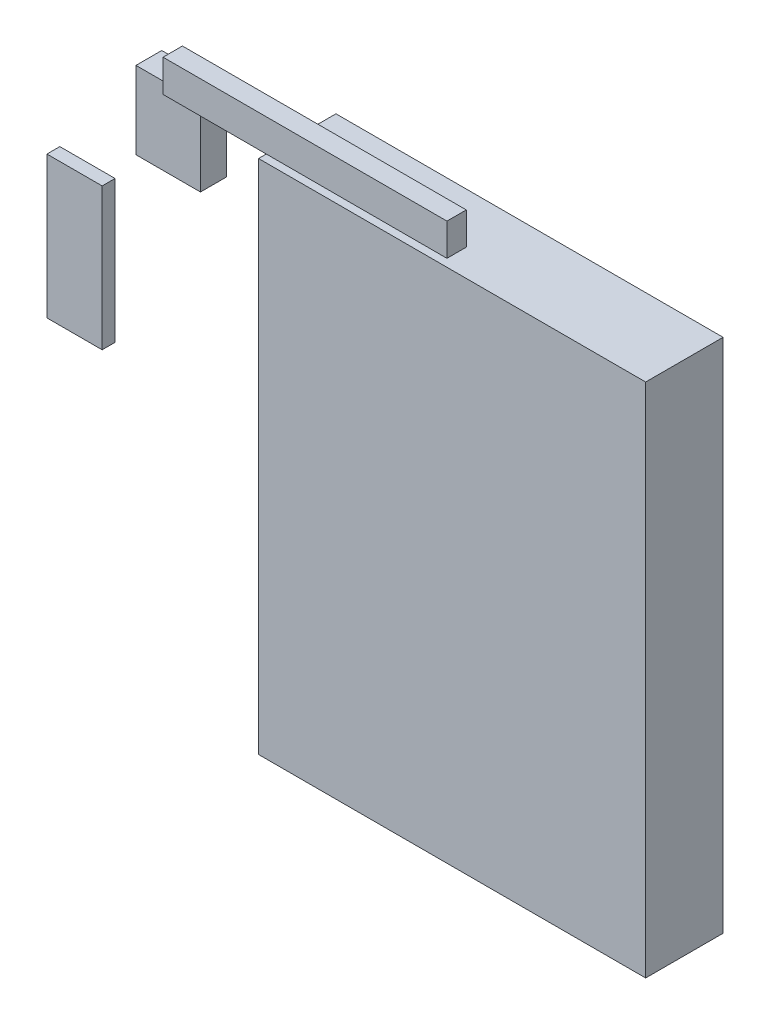
ISO-10303-21;
HEADER;
FILE_DESCRIPTION(('STEP AP214'),'2;1');
FILE_NAME('part.step','',(''),(''),'','','');
FILE_SCHEMA(('AUTOMOTIVE_DESIGN { 1 0 10303 214 1 1 1 1 }'));
ENDSEC;
DATA;
#1=APPLICATION_CONTEXT('core data for automotive mechanical design processes');
#2=APPLICATION_PROTOCOL_DEFINITION('international standard','automotive_design',2000,#1);
#3=PRODUCT_CONTEXT('',#1,'mechanical');
#4=PRODUCT('Part','Part','',(#3));
#5=PRODUCT_RELATED_PRODUCT_CATEGORY('part','',(#4));
#6=PRODUCT_DEFINITION_FORMATION('','',#4);
#7=PRODUCT_DEFINITION_CONTEXT('part definition',#1,'design');
#8=PRODUCT_DEFINITION('design','',#6,#7);
#9=PRODUCT_DEFINITION_SHAPE('','',#8);
#10=(LENGTH_UNIT() NAMED_UNIT(*) SI_UNIT(.MILLI.,.METRE.));
#11=(NAMED_UNIT(*) PLANE_ANGLE_UNIT() SI_UNIT($,.RADIAN.));
#12=(NAMED_UNIT(*) SI_UNIT($,.STERADIAN.) SOLID_ANGLE_UNIT());
#13=UNCERTAINTY_MEASURE_WITH_UNIT(LENGTH_MEASURE(1.E-05),#10,'distance_accuracy_value','');
#14=(GEOMETRIC_REPRESENTATION_CONTEXT(3) GLOBAL_UNCERTAINTY_ASSIGNED_CONTEXT((#13)) GLOBAL_UNIT_ASSIGNED_CONTEXT((#10,
#11,#12)) REPRESENTATION_CONTEXT('',''));
#15=CARTESIAN_POINT('',(0.,0.,0.));
#16=DIRECTION('',(0.,0.,1.));
#17=DIRECTION('',(1.,0.,0.));
#18=AXIS2_PLACEMENT_3D('',#15,#16,#17);
#19=CARTESIAN_POINT('',(-4.,49.5,3.));
#20=DIRECTION('',(1.,0.,0.));
#21=DIRECTION('',(0.,0.,-1.));
#22=AXIS2_PLACEMENT_3D('',#19,#20,#21);
#23=PLANE('',#22);
#24=DIRECTION('',(0.,-1.,0.));
#25=VECTOR('',#24,1.);
#26=CARTESIAN_POINT('',(-4.,49.5,2.));
#27=LINE('',#26,#25);
#28=CARTESIAN_POINT('',(-4.,49.5,2.));
#29=VERTEX_POINT('',#28);
#30=CARTESIAN_POINT('',(-4.,38.5,2.));
#31=VERTEX_POINT('',#30);
#32=EDGE_CURVE('E113',#29,#31,#27,.T.);
#33=ORIENTED_EDGE('',*,*,#32,.T.);
#34=DIRECTION('',(0.,0.,-1.));
#35=VECTOR('',#34,1.);
#36=CARTESIAN_POINT('',(-4.,38.5,3.));
#37=LINE('',#36,#35);
#38=CARTESIAN_POINT('',(-4.,38.5,3.));
#39=VERTEX_POINT('',#38);
#40=EDGE_CURVE('E12',#39,#31,#37,.T.);
#41=ORIENTED_EDGE('',*,*,#40,.F.);
#42=DIRECTION('',(0.,-1.,0.));
#43=VECTOR('',#42,1.);
#44=CARTESIAN_POINT('',(-4.,49.5,3.));
#45=LINE('',#44,#43);
#46=CARTESIAN_POINT('',(-4.,49.5,3.));
#47=VERTEX_POINT('',#46);
#48=EDGE_CURVE('E101',#47,#39,#45,.T.);
#49=ORIENTED_EDGE('',*,*,#48,.F.);
#50=DIRECTION('',(0.,0.,-1.));
#51=VECTOR('',#50,1.);
#52=CARTESIAN_POINT('',(-4.,49.5,3.));
#53=LINE('',#52,#51);
#54=EDGE_CURVE('E109',#47,#29,#53,.T.);
#55=ORIENTED_EDGE('',*,*,#54,.T.);
#56=EDGE_LOOP('',(#33,#41,#49,#55));
#57=FACE_BOUND('',#56,.T.);
#58=ADVANCED_FACE('F50',(#57),#23,.F.);
#59=CARTESIAN_POINT('',(-4.,38.5,3.));
#60=DIRECTION('',(0.,1.,0.));
#61=DIRECTION('',(0.,0.,1.));
#62=AXIS2_PLACEMENT_3D('',#59,#60,#61);
#63=PLANE('',#62);
#64=DIRECTION('',(1.,0.,0.));
#65=VECTOR('',#64,1.);
#66=CARTESIAN_POINT('',(-4.,38.5,2.));
#67=LINE('',#66,#65);
#68=CARTESIAN_POINT('',(0.28,38.5,2.));
#69=VERTEX_POINT('',#68);
#70=EDGE_CURVE('E105',#31,#69,#67,.T.);
#71=ORIENTED_EDGE('',*,*,#70,.T.);
#72=DIRECTION('',(0.,0.,-1.));
#73=VECTOR('',#72,1.);
#74=CARTESIAN_POINT('',(0.28,38.5,3.));
#75=LINE('',#74,#73);
#76=CARTESIAN_POINT('',(0.28,38.5,3.));
#77=VERTEX_POINT('',#76);
#78=EDGE_CURVE('E58',#77,#69,#75,.T.);
#79=ORIENTED_EDGE('',*,*,#78,.F.);
#80=DIRECTION('',(1.,0.,0.));
#81=VECTOR('',#80,1.);
#82=CARTESIAN_POINT('',(-4.,38.5,3.));
#83=LINE('',#82,#81);
#84=EDGE_CURVE('E96',#39,#77,#83,.T.);
#85=ORIENTED_EDGE('',*,*,#84,.F.);
#86=ORIENTED_EDGE('',*,*,#40,.T.);
#87=EDGE_LOOP('',(#71,#79,#85,#86));
#88=FACE_BOUND('',#87,.T.);
#89=ADVANCED_FACE('F104',(#88),#63,.F.);
#90=CARTESIAN_POINT('',(0.28,38.5,3.));
#91=DIRECTION('',(-1.,0.,0.));
#92=DIRECTION('',(0.,0.,1.));
#93=AXIS2_PLACEMENT_3D('',#90,#91,#92);
#94=PLANE('',#93);
#95=DIRECTION('',(0.,1.,0.));
#96=VECTOR('',#95,1.);
#97=CARTESIAN_POINT('',(0.28,38.5,2.));
#98=LINE('',#97,#96);
#99=CARTESIAN_POINT('',(0.28,49.5,2.));
#100=VERTEX_POINT('',#99);
#101=EDGE_CURVE('E83',#69,#100,#98,.T.);
#102=ORIENTED_EDGE('',*,*,#101,.T.);
#103=DIRECTION('',(0.,0.,-1.));
#104=VECTOR('',#103,1.);
#105=CARTESIAN_POINT('',(0.28,49.5,3.));
#106=LINE('',#105,#104);
#107=CARTESIAN_POINT('',(0.28,49.5,3.));
#108=VERTEX_POINT('',#107);
#109=EDGE_CURVE('E106',#108,#100,#106,.T.);
#110=ORIENTED_EDGE('',*,*,#109,.F.);
#111=DIRECTION('',(0.,1.,0.));
#112=VECTOR('',#111,1.);
#113=CARTESIAN_POINT('',(0.28,38.5,3.));
#114=LINE('',#113,#112);
#115=EDGE_CURVE('E99',#77,#108,#114,.T.);
#116=ORIENTED_EDGE('',*,*,#115,.F.);
#117=ORIENTED_EDGE('',*,*,#78,.T.);
#118=EDGE_LOOP('',(#102,#110,#116,#117));
#119=FACE_BOUND('',#118,.T.);
#120=ADVANCED_FACE('F107',(#119),#94,.F.);
#121=CARTESIAN_POINT('',(0.28,49.5,3.));
#122=DIRECTION('',(0.,-1.,0.));
#123=DIRECTION('',(0.,0.,-1.));
#124=AXIS2_PLACEMENT_3D('',#121,#122,#123);
#125=PLANE('',#124);
#126=DIRECTION('',(-1.,0.,0.));
#127=VECTOR('',#126,1.);
#128=CARTESIAN_POINT('',(0.28,49.5,2.));
#129=LINE('',#128,#127);
#130=EDGE_CURVE('E89',#100,#29,#129,.T.);
#131=ORIENTED_EDGE('',*,*,#130,.T.);
#132=ORIENTED_EDGE('',*,*,#54,.F.);
#133=DIRECTION('',(-1.,0.,0.));
#134=VECTOR('',#133,1.);
#135=CARTESIAN_POINT('',(0.28,49.5,3.));
#136=LINE('',#135,#134);
#137=EDGE_CURVE('E66',#108,#47,#136,.T.);
#138=ORIENTED_EDGE('',*,*,#137,.F.);
#139=ORIENTED_EDGE('',*,*,#109,.T.);
#140=EDGE_LOOP('',(#131,#132,#138,#139));
#141=FACE_BOUND('',#140,.T.);
#142=ADVANCED_FACE('F120',(#141),#125,.F.);
#143=CARTESIAN_POINT('',(0.,0.,3.));
#144=DIRECTION('',(0.,0.,1.));
#145=DIRECTION('',(1.,0.,0.));
#146=AXIS2_PLACEMENT_3D('',#143,#144,#145);
#147=PLANE('',#146);
#148=ORIENTED_EDGE('',*,*,#48,.T.);
#149=ORIENTED_EDGE('',*,*,#84,.T.);
#150=ORIENTED_EDGE('',*,*,#115,.T.);
#151=ORIENTED_EDGE('',*,*,#137,.T.);
#152=EDGE_LOOP('',(#148,#149,#150,#151));
#153=FACE_BOUND('',#152,.T.);
#154=ADVANCED_FACE('F97',(#153),#147,.T.);
#155=CARTESIAN_POINT('',(0.,0.,2.));
#156=DIRECTION('',(0.,0.,1.));
#157=DIRECTION('',(1.,0.,0.));
#158=AXIS2_PLACEMENT_3D('',#155,#156,#157);
#159=PLANE('',#158);
#160=ORIENTED_EDGE('',*,*,#32,.F.);
#161=ORIENTED_EDGE('',*,*,#130,.F.);
#162=ORIENTED_EDGE('',*,*,#101,.F.);
#163=ORIENTED_EDGE('',*,*,#70,.F.);
#164=EDGE_LOOP('',(#160,#161,#162,#163));
#165=FACE_BOUND('',#164,.T.);
#166=ADVANCED_FACE('F123',(#165),#159,.F.);
#167=CLOSED_SHELL('',(#58,#89,#120,#142,#154,#166));
#168=MANIFOLD_SOLID_BREP('B2',#167);
#169=CARTESIAN_POINT('',(12.,67.5,10.));
#170=DIRECTION('',(1.,0.,0.));
#171=DIRECTION('',(0.,0.,-1.));
#172=AXIS2_PLACEMENT_3D('',#169,#170,#171);
#173=PLANE('',#172);
#174=DIRECTION('',(0.,0.,-1.));
#175=VECTOR('',#174,1.);
#176=CARTESIAN_POINT('',(12.,65.5,10.));
#177=LINE('',#176,#175);
#178=CARTESIAN_POINT('',(12.,65.5,9.6));
#179=VERTEX_POINT('',#178);
#180=CARTESIAN_POINT('',(12.,65.5,8.5));
#181=VERTEX_POINT('',#180);
#182=EDGE_CURVE('E209',#179,#181,#177,.T.);
#183=ORIENTED_EDGE('',*,*,#182,.F.);
#184=DIRECTION('',(0.,-1.,0.));
#185=VECTOR('',#184,1.);
#186=CARTESIAN_POINT('',(12.,67.5,9.6));
#187=LINE('',#186,#185);
#188=CARTESIAN_POINT('',(12.,65.,9.6));
#189=VERTEX_POINT('',#188);
#190=EDGE_CURVE('E305',#179,#189,#187,.T.);
#191=ORIENTED_EDGE('',*,*,#190,.T.);
#192=DIRECTION('',(0.,0.,-1.));
#193=VECTOR('',#192,1.);
#194=CARTESIAN_POINT('',(12.,65.,10.));
#195=LINE('',#194,#193);
#196=CARTESIAN_POINT('',(12.,65.,10.));
#197=VERTEX_POINT('',#196);
#198=EDGE_CURVE('E333',#197,#189,#195,.T.);
#199=ORIENTED_EDGE('',*,*,#198,.F.);
#200=DIRECTION('',(0.,-1.,0.));
#201=VECTOR('',#200,1.);
#202=CARTESIAN_POINT('',(12.,67.5,10.));
#203=LINE('',#202,#201);
#204=CARTESIAN_POINT('',(12.,67.5,10.));
#205=VERTEX_POINT('',#204);
#206=EDGE_CURVE('E308',#205,#197,#203,.T.);
#207=ORIENTED_EDGE('',*,*,#206,.F.);
#208=DIRECTION('',(0.,0.,-1.));
#209=VECTOR('',#208,1.);
#210=CARTESIAN_POINT('',(12.,67.5,10.));
#211=LINE('',#210,#209);
#212=CARTESIAN_POINT('',(12.,67.5,8.5));
#213=VERTEX_POINT('',#212);
#214=EDGE_CURVE('E318',#205,#213,#211,.T.);
#215=ORIENTED_EDGE('',*,*,#214,.T.);
#216=DIRECTION('',(0.,-1.,0.));
#217=VECTOR('',#216,1.);
#218=CARTESIAN_POINT('',(12.,67.5,8.5));
#219=LINE('',#218,#217);
#220=EDGE_CURVE('E307',#213,#181,#219,.T.);
#221=ORIENTED_EDGE('',*,*,#220,.T.);
#222=EDGE_LOOP('',(#183,#191,#199,#207,#215,#221));
#223=FACE_BOUND('',#222,.T.);
#224=ADVANCED_FACE('F195',(#223),#173,.F.);
#225=CARTESIAN_POINT('',(12.,65.,10.));
#226=DIRECTION('',(0.,1.,0.));
#227=DIRECTION('',(0.,0.,1.));
#228=AXIS2_PLACEMENT_3D('',#225,#226,#227);
#229=PLANE('',#228);
#230=DIRECTION('',(0.,0.,1.));
#231=VECTOR('',#230,1.);
#232=CARTESIAN_POINT('',(14.5,65.,10.));
#233=LINE('',#232,#231);
#234=CARTESIAN_POINT('',(14.5,65.,8.5));
#235=VERTEX_POINT('',#234);
#236=CARTESIAN_POINT('',(14.5,65.,9.6));
#237=VERTEX_POINT('',#236);
#238=EDGE_CURVE('E298',#235,#237,#233,.T.);
#239=ORIENTED_EDGE('',*,*,#238,.F.);
#240=DIRECTION('',(1.,0.,0.));
#241=VECTOR('',#240,1.);
#242=CARTESIAN_POINT('',(12.,65.,8.5));
#243=LINE('',#242,#241);
#244=CARTESIAN_POINT('',(34.,65.,8.5));
#245=VERTEX_POINT('',#244);
#246=EDGE_CURVE('E320',#235,#245,#243,.T.);
#247=ORIENTED_EDGE('',*,*,#246,.T.);
#248=DIRECTION('',(0.,0.,-1.));
#249=VECTOR('',#248,1.);
#250=CARTESIAN_POINT('',(34.,65.,10.));
#251=LINE('',#250,#249);
#252=CARTESIAN_POINT('',(34.,65.,10.));
#253=VERTEX_POINT('',#252);
#254=EDGE_CURVE('E330',#253,#245,#251,.T.);
#255=ORIENTED_EDGE('',*,*,#254,.F.);
#256=DIRECTION('',(1.,0.,0.));
#257=VECTOR('',#256,1.);
#258=CARTESIAN_POINT('',(12.,65.,10.));
#259=LINE('',#258,#257);
#260=EDGE_CURVE('E311',#197,#253,#259,.T.);
#261=ORIENTED_EDGE('',*,*,#260,.F.);
#262=ORIENTED_EDGE('',*,*,#198,.T.);
#263=DIRECTION('',(1.,0.,0.));
#264=VECTOR('',#263,1.);
#265=CARTESIAN_POINT('',(12.,65.,9.6));
#266=LINE('',#265,#264);
#267=EDGE_CURVE('E48',#189,#237,#266,.T.);
#268=ORIENTED_EDGE('',*,*,#267,.T.);
#269=EDGE_LOOP('',(#239,#247,#255,#261,#262,#268));
#270=FACE_BOUND('',#269,.T.);
#271=ADVANCED_FACE('F365',(#270),#229,.F.);
#272=CARTESIAN_POINT('',(0.,0.,8.5));
#273=DIRECTION('',(0.,0.,1.));
#274=DIRECTION('',(1.,0.,0.));
#275=AXIS2_PLACEMENT_3D('',#272,#273,#274);
#276=PLANE('',#275);
#277=DIRECTION('',(0.,-1.,0.));
#278=VECTOR('',#277,1.);
#279=CARTESIAN_POINT('',(14.5,0.,8.5));
#280=LINE('',#279,#278);
#281=CARTESIAN_POINT('',(14.5,65.5,8.5));
#282=VERTEX_POINT('',#281);
#283=EDGE_CURVE('E202',#282,#235,#280,.T.);
#284=ORIENTED_EDGE('',*,*,#283,.F.);
#285=DIRECTION('',(1.,0.,0.));
#286=VECTOR('',#285,1.);
#287=CARTESIAN_POINT('',(0.,65.5,8.5));
#288=LINE('',#287,#286);
#289=EDGE_CURVE('E335',#181,#282,#288,.T.);
#290=ORIENTED_EDGE('',*,*,#289,.F.);
#291=ORIENTED_EDGE('',*,*,#220,.F.);
#292=DIRECTION('',(-1.,0.,0.));
#293=VECTOR('',#292,1.);
#294=CARTESIAN_POINT('',(34.,67.5,8.5));
#295=LINE('',#294,#293);
#296=CARTESIAN_POINT('',(34.,67.5,8.5));
#297=VERTEX_POINT('',#296);
#298=EDGE_CURVE('E312',#297,#213,#295,.T.);
#299=ORIENTED_EDGE('',*,*,#298,.F.);
#300=DIRECTION('',(0.,1.,0.));
#301=VECTOR('',#300,1.);
#302=CARTESIAN_POINT('',(34.,65.,8.5));
#303=LINE('',#302,#301);
#304=EDGE_CURVE('E322',#245,#297,#303,.T.);
#305=ORIENTED_EDGE('',*,*,#304,.F.);
#306=ORIENTED_EDGE('',*,*,#246,.F.);
#307=EDGE_LOOP('',(#284,#290,#291,#299,#305,#306));
#308=FACE_BOUND('',#307,.T.);
#309=ADVANCED_FACE('F344',(#308),#276,.F.);
#310=CARTESIAN_POINT('',(34.,65.,10.));
#311=DIRECTION('',(-1.,0.,0.));
#312=DIRECTION('',(0.,0.,1.));
#313=AXIS2_PLACEMENT_3D('',#310,#311,#312);
#314=PLANE('',#313);
#315=ORIENTED_EDGE('',*,*,#304,.T.);
#316=DIRECTION('',(0.,0.,-1.));
#317=VECTOR('',#316,1.);
#318=CARTESIAN_POINT('',(34.,67.5,10.));
#319=LINE('',#318,#317);
#320=CARTESIAN_POINT('',(34.,67.5,10.));
#321=VERTEX_POINT('',#320);
#322=EDGE_CURVE('E327',#321,#297,#319,.T.);
#323=ORIENTED_EDGE('',*,*,#322,.F.);
#324=DIRECTION('',(0.,1.,0.));
#325=VECTOR('',#324,1.);
#326=CARTESIAN_POINT('',(34.,65.,10.));
#327=LINE('',#326,#325);
#328=EDGE_CURVE('E314',#253,#321,#327,.T.);
#329=ORIENTED_EDGE('',*,*,#328,.F.);
#330=ORIENTED_EDGE('',*,*,#254,.T.);
#331=EDGE_LOOP('',(#315,#323,#329,#330));
#332=FACE_BOUND('',#331,.T.);
#333=ADVANCED_FACE('F377',(#332),#314,.F.);
#334=CARTESIAN_POINT('',(34.,67.5,10.));
#335=DIRECTION('',(0.,-1.,0.));
#336=DIRECTION('',(0.,0.,-1.));
#337=AXIS2_PLACEMENT_3D('',#334,#335,#336);
#338=PLANE('',#337);
#339=ORIENTED_EDGE('',*,*,#298,.T.);
#340=ORIENTED_EDGE('',*,*,#214,.F.);
#341=DIRECTION('',(-1.,0.,0.));
#342=VECTOR('',#341,1.);
#343=CARTESIAN_POINT('',(34.,67.5,10.));
#344=LINE('',#343,#342);
#345=EDGE_CURVE('E316',#321,#205,#344,.T.);
#346=ORIENTED_EDGE('',*,*,#345,.F.);
#347=ORIENTED_EDGE('',*,*,#322,.T.);
#348=EDGE_LOOP('',(#339,#340,#346,#347));
#349=FACE_BOUND('',#348,.T.);
#350=ADVANCED_FACE('F374',(#349),#338,.F.);
#351=CARTESIAN_POINT('',(0.,0.,10.));
#352=DIRECTION('',(0.,0.,1.));
#353=DIRECTION('',(1.,0.,0.));
#354=AXIS2_PLACEMENT_3D('',#351,#352,#353);
#355=PLANE('',#354);
#356=ORIENTED_EDGE('',*,*,#206,.T.);
#357=ORIENTED_EDGE('',*,*,#260,.T.);
#358=ORIENTED_EDGE('',*,*,#328,.T.);
#359=ORIENTED_EDGE('',*,*,#345,.T.);
#360=EDGE_LOOP('',(#356,#357,#358,#359));
#361=FACE_BOUND('',#360,.T.);
#362=ADVANCED_FACE('F369',(#361),#355,.T.);
#363=CARTESIAN_POINT('',(0.,0.,9.6));
#364=DIRECTION('',(0.,0.,1.));
#365=DIRECTION('',(1.,0.,0.));
#366=AXIS2_PLACEMENT_3D('',#363,#364,#365);
#367=PLANE('',#366);
#368=ORIENTED_EDGE('',*,*,#190,.F.);
#369=DIRECTION('',(-1.,0.,0.));
#370=VECTOR('',#369,1.);
#371=CARTESIAN_POINT('',(14.5,65.5,9.6));
#372=LINE('',#371,#370);
#373=CARTESIAN_POINT('',(9.5,65.5,9.6));
#374=VERTEX_POINT('',#373);
#375=EDGE_CURVE('E288',#179,#374,#372,.T.);
#376=ORIENTED_EDGE('',*,*,#375,.T.);
#377=DIRECTION('',(0.,-1.,0.));
#378=VECTOR('',#377,1.);
#379=CARTESIAN_POINT('',(9.5,65.5,9.6));
#380=LINE('',#379,#378);
#381=CARTESIAN_POINT('',(9.5,59.5,9.6));
#382=VERTEX_POINT('',#381);
#383=EDGE_CURVE('E283',#374,#382,#380,.T.);
#384=ORIENTED_EDGE('',*,*,#383,.T.);
#385=DIRECTION('',(1.,0.,0.));
#386=VECTOR('',#385,1.);
#387=CARTESIAN_POINT('',(9.5,59.5,9.6));
#388=LINE('',#387,#386);
#389=CARTESIAN_POINT('',(14.5,59.5,9.6));
#390=VERTEX_POINT('',#389);
#391=EDGE_CURVE('E271',#382,#390,#388,.T.);
#392=ORIENTED_EDGE('',*,*,#391,.T.);
#393=DIRECTION('',(0.,1.,0.));
#394=VECTOR('',#393,1.);
#395=CARTESIAN_POINT('',(14.5,59.5,9.6));
#396=LINE('',#395,#394);
#397=EDGE_CURVE('E282',#390,#237,#396,.T.);
#398=ORIENTED_EDGE('',*,*,#397,.T.);
#399=ORIENTED_EDGE('',*,*,#267,.F.);
#400=EDGE_LOOP('',(#368,#376,#384,#392,#398,#399));
#401=FACE_BOUND('',#400,.T.);
#402=ADVANCED_FACE('F286',(#401),#367,.T.);
#403=CARTESIAN_POINT('',(14.5,59.5,9.6));
#404=DIRECTION('',(-1.,0.,0.));
#405=DIRECTION('',(0.,0.,1.));
#406=AXIS2_PLACEMENT_3D('',#403,#404,#405);
#407=PLANE('',#406);
#408=ORIENTED_EDGE('',*,*,#283,.T.);
#409=ORIENTED_EDGE('',*,*,#238,.T.);
#410=ORIENTED_EDGE('',*,*,#397,.F.);
#411=DIRECTION('',(0.,0.,-1.));
#412=VECTOR('',#411,1.);
#413=CARTESIAN_POINT('',(14.5,59.5,9.6));
#414=LINE('',#413,#412);
#415=CARTESIAN_POINT('',(14.5,59.5,7.6));
#416=VERTEX_POINT('',#415);
#417=EDGE_CURVE('E278',#390,#416,#414,.T.);
#418=ORIENTED_EDGE('',*,*,#417,.T.);
#419=DIRECTION('',(0.,1.,0.));
#420=VECTOR('',#419,1.);
#421=CARTESIAN_POINT('',(14.5,59.5,7.6));
#422=LINE('',#421,#420);
#423=CARTESIAN_POINT('',(14.5,65.5,7.6));
#424=VERTEX_POINT('',#423);
#425=EDGE_CURVE('E357',#416,#424,#422,.T.);
#426=ORIENTED_EDGE('',*,*,#425,.T.);
#427=DIRECTION('',(0.,0.,-1.));
#428=VECTOR('',#427,1.);
#429=CARTESIAN_POINT('',(14.5,65.5,9.6));
#430=LINE('',#429,#428);
#431=EDGE_CURVE('E300',#282,#424,#430,.T.);
#432=ORIENTED_EDGE('',*,*,#431,.F.);
#433=EDGE_LOOP('',(#408,#409,#410,#418,#426,#432));
#434=FACE_BOUND('',#433,.T.);
#435=ADVANCED_FACE('F340',(#434),#407,.F.);
#436=CARTESIAN_POINT('',(14.5,65.5,9.6));
#437=DIRECTION('',(0.,-1.,0.));
#438=DIRECTION('',(0.,0.,-1.));
#439=AXIS2_PLACEMENT_3D('',#436,#437,#438);
#440=PLANE('',#439);
#441=ORIENTED_EDGE('',*,*,#375,.F.);
#442=ORIENTED_EDGE('',*,*,#182,.T.);
#443=ORIENTED_EDGE('',*,*,#289,.T.);
#444=ORIENTED_EDGE('',*,*,#431,.T.);
#445=DIRECTION('',(-1.,0.,0.));
#446=VECTOR('',#445,1.);
#447=CARTESIAN_POINT('',(14.5,65.5,7.6));
#448=LINE('',#447,#446);
#449=CARTESIAN_POINT('',(9.5,65.5,7.6));
#450=VERTEX_POINT('',#449);
#451=EDGE_CURVE('E292',#424,#450,#448,.T.);
#452=ORIENTED_EDGE('',*,*,#451,.T.);
#453=DIRECTION('',(0.,0.,-1.));
#454=VECTOR('',#453,1.);
#455=CARTESIAN_POINT('',(9.5,65.5,9.6));
#456=LINE('',#455,#454);
#457=EDGE_CURVE('E349',#374,#450,#456,.T.);
#458=ORIENTED_EDGE('',*,*,#457,.F.);
#459=EDGE_LOOP('',(#441,#442,#443,#444,#452,#458));
#460=FACE_BOUND('',#459,.T.);
#461=ADVANCED_FACE('F348',(#460),#440,.F.);
#462=CARTESIAN_POINT('',(9.5,65.5,9.6));
#463=DIRECTION('',(1.,0.,0.));
#464=DIRECTION('',(0.,0.,-1.));
#465=AXIS2_PLACEMENT_3D('',#462,#463,#464);
#466=PLANE('',#465);
#467=DIRECTION('',(0.,-1.,0.));
#468=VECTOR('',#467,1.);
#469=CARTESIAN_POINT('',(9.5,65.5,7.6));
#470=LINE('',#469,#468);
#471=CARTESIAN_POINT('',(9.5,59.5,7.6));
#472=VERTEX_POINT('',#471);
#473=EDGE_CURVE('E296',#450,#472,#470,.T.);
#474=ORIENTED_EDGE('',*,*,#473,.T.);
#475=DIRECTION('',(0.,0.,-1.));
#476=VECTOR('',#475,1.);
#477=CARTESIAN_POINT('',(9.5,59.5,9.6));
#478=LINE('',#477,#476);
#479=EDGE_CURVE('E275',#382,#472,#478,.T.);
#480=ORIENTED_EDGE('',*,*,#479,.F.);
#481=ORIENTED_EDGE('',*,*,#383,.F.);
#482=ORIENTED_EDGE('',*,*,#457,.T.);
#483=EDGE_LOOP('',(#474,#480,#481,#482));
#484=FACE_BOUND('',#483,.T.);
#485=ADVANCED_FACE('F294',(#484),#466,.F.);
#486=CARTESIAN_POINT('',(9.5,59.5,9.6));
#487=DIRECTION('',(0.,1.,0.));
#488=DIRECTION('',(0.,0.,1.));
#489=AXIS2_PLACEMENT_3D('',#486,#487,#488);
#490=PLANE('',#489);
#491=DIRECTION('',(1.,0.,0.));
#492=VECTOR('',#491,1.);
#493=CARTESIAN_POINT('',(9.5,59.5,7.6));
#494=LINE('',#493,#492);
#495=EDGE_CURVE('E355',#472,#416,#494,.T.);
#496=ORIENTED_EDGE('',*,*,#495,.T.);
#497=ORIENTED_EDGE('',*,*,#417,.F.);
#498=ORIENTED_EDGE('',*,*,#391,.F.);
#499=ORIENTED_EDGE('',*,*,#479,.T.);
#500=EDGE_LOOP('',(#496,#497,#498,#499));
#501=FACE_BOUND('',#500,.T.);
#502=ADVANCED_FACE('F273',(#501),#490,.F.);
#503=CARTESIAN_POINT('',(0.,0.,7.6));
#504=DIRECTION('',(0.,0.,1.));
#505=DIRECTION('',(1.,0.,0.));
#506=AXIS2_PLACEMENT_3D('',#503,#504,#505);
#507=PLANE('',#506);
#508=ORIENTED_EDGE('',*,*,#473,.F.);
#509=ORIENTED_EDGE('',*,*,#451,.F.);
#510=ORIENTED_EDGE('',*,*,#425,.F.);
#511=ORIENTED_EDGE('',*,*,#495,.F.);
#512=EDGE_LOOP('',(#508,#509,#510,#511));
#513=FACE_BOUND('',#512,.T.);
#514=ADVANCED_FACE('F362',(#513),#507,.F.);
#515=CLOSED_SHELL('',(#224,#271,#309,#333,#350,#362,#402,#435,#461,#485,#502,#514));
#516=MANIFOLD_SOLID_BREP('B6',#515);
#517=CARTESIAN_POINT('',(19.,64.,9.6));
#518=DIRECTION('',(1.,0.,0.));
#519=DIRECTION('',(0.,0.,-1.));
#520=AXIS2_PLACEMENT_3D('',#517,#518,#519);
#521=PLANE('',#520);
#522=DIRECTION('',(0.,-1.,0.));
#523=VECTOR('',#522,1.);
#524=CARTESIAN_POINT('',(19.,64.,3.6));
#525=LINE('',#524,#523);
#526=CARTESIAN_POINT('',(19.,64.,3.6));
#527=VERTEX_POINT('',#526);
#528=CARTESIAN_POINT('',(19.,24.,3.6));
#529=VERTEX_POINT('',#528);
#530=EDGE_CURVE('E562',#527,#529,#525,.T.);
#531=ORIENTED_EDGE('',*,*,#530,.T.);
#532=DIRECTION('',(0.,0.,-1.));
#533=VECTOR('',#532,1.);
#534=CARTESIAN_POINT('',(19.,24.,9.6));
#535=LINE('',#534,#533);
#536=CARTESIAN_POINT('',(19.,24.,9.6));
#537=VERTEX_POINT('',#536);
#538=EDGE_CURVE('E193',#537,#529,#535,.T.);
#539=ORIENTED_EDGE('',*,*,#538,.F.);
#540=DIRECTION('',(0.,-1.,0.));
#541=VECTOR('',#540,1.);
#542=CARTESIAN_POINT('',(19.,64.,9.6));
#543=LINE('',#542,#541);
#544=CARTESIAN_POINT('',(19.,64.,9.6));
#545=VERTEX_POINT('',#544);
#546=EDGE_CURVE('E550',#545,#537,#543,.T.);
#547=ORIENTED_EDGE('',*,*,#546,.F.);
#548=DIRECTION('',(0.,0.,-1.));
#549=VECTOR('',#548,1.);
#550=CARTESIAN_POINT('',(19.,64.,9.6));
#551=LINE('',#550,#549);
#552=EDGE_CURVE('E558',#545,#527,#551,.T.);
#553=ORIENTED_EDGE('',*,*,#552,.T.);
#554=EDGE_LOOP('',(#531,#539,#547,#553));
#555=FACE_BOUND('',#554,.T.);
#556=ADVANCED_FACE('F499',(#555),#521,.F.);
#557=CARTESIAN_POINT('',(19.,24.,9.6));
#558=DIRECTION('',(0.,1.,0.));
#559=DIRECTION('',(0.,0.,1.));
#560=AXIS2_PLACEMENT_3D('',#557,#558,#559);
#561=PLANE('',#560);
#562=DIRECTION('',(1.,0.,0.));
#563=VECTOR('',#562,1.);
#564=CARTESIAN_POINT('',(19.,24.,3.6));
#565=LINE('',#564,#563);
#566=CARTESIAN_POINT('',(49.,24.,3.6));
#567=VERTEX_POINT('',#566);
#568=EDGE_CURVE('E554',#529,#567,#565,.T.);
#569=ORIENTED_EDGE('',*,*,#568,.T.);
#570=DIRECTION('',(0.,0.,-1.));
#571=VECTOR('',#570,1.);
#572=CARTESIAN_POINT('',(49.,24.,9.6));
#573=LINE('',#572,#571);
#574=CARTESIAN_POINT('',(49.,24.,9.6));
#575=VERTEX_POINT('',#574);
#576=EDGE_CURVE('E507',#575,#567,#573,.T.);
#577=ORIENTED_EDGE('',*,*,#576,.F.);
#578=DIRECTION('',(1.,0.,0.));
#579=VECTOR('',#578,1.);
#580=CARTESIAN_POINT('',(19.,24.,9.6));
#581=LINE('',#580,#579);
#582=EDGE_CURVE('E545',#537,#575,#581,.T.);
#583=ORIENTED_EDGE('',*,*,#582,.F.);
#584=ORIENTED_EDGE('',*,*,#538,.T.);
#585=EDGE_LOOP('',(#569,#577,#583,#584));
#586=FACE_BOUND('',#585,.T.);
#587=ADVANCED_FACE('F553',(#586),#561,.F.);
#588=CARTESIAN_POINT('',(49.,24.,9.6));
#589=DIRECTION('',(-1.,0.,0.));
#590=DIRECTION('',(0.,0.,1.));
#591=AXIS2_PLACEMENT_3D('',#588,#589,#590);
#592=PLANE('',#591);
#593=DIRECTION('',(0.,1.,0.));
#594=VECTOR('',#593,1.);
#595=CARTESIAN_POINT('',(49.,24.,3.6));
#596=LINE('',#595,#594);
#597=CARTESIAN_POINT('',(49.,64.,3.6));
#598=VERTEX_POINT('',#597);
#599=EDGE_CURVE('E532',#567,#598,#596,.T.);
#600=ORIENTED_EDGE('',*,*,#599,.T.);
#601=DIRECTION('',(0.,0.,-1.));
#602=VECTOR('',#601,1.);
#603=CARTESIAN_POINT('',(49.,64.,9.6));
#604=LINE('',#603,#602);
#605=CARTESIAN_POINT('',(49.,64.,9.6));
#606=VERTEX_POINT('',#605);
#607=EDGE_CURVE('E555',#606,#598,#604,.T.);
#608=ORIENTED_EDGE('',*,*,#607,.F.);
#609=DIRECTION('',(0.,1.,0.));
#610=VECTOR('',#609,1.);
#611=CARTESIAN_POINT('',(49.,24.,9.6));
#612=LINE('',#611,#610);
#613=EDGE_CURVE('E548',#575,#606,#612,.T.);
#614=ORIENTED_EDGE('',*,*,#613,.F.);
#615=ORIENTED_EDGE('',*,*,#576,.T.);
#616=EDGE_LOOP('',(#600,#608,#614,#615));
#617=FACE_BOUND('',#616,.T.);
#618=ADVANCED_FACE('F556',(#617),#592,.F.);
#619=CARTESIAN_POINT('',(49.,64.,9.6));
#620=DIRECTION('',(0.,-1.,0.));
#621=DIRECTION('',(0.,0.,-1.));
#622=AXIS2_PLACEMENT_3D('',#619,#620,#621);
#623=PLANE('',#622);
#624=DIRECTION('',(-1.,0.,0.));
#625=VECTOR('',#624,1.);
#626=CARTESIAN_POINT('',(49.,64.,3.6));
#627=LINE('',#626,#625);
#628=EDGE_CURVE('E538',#598,#527,#627,.T.);
#629=ORIENTED_EDGE('',*,*,#628,.T.);
#630=ORIENTED_EDGE('',*,*,#552,.F.);
#631=DIRECTION('',(-1.,0.,0.));
#632=VECTOR('',#631,1.);
#633=CARTESIAN_POINT('',(49.,64.,9.6));
#634=LINE('',#633,#632);
#635=EDGE_CURVE('E515',#606,#545,#634,.T.);
#636=ORIENTED_EDGE('',*,*,#635,.F.);
#637=ORIENTED_EDGE('',*,*,#607,.T.);
#638=EDGE_LOOP('',(#629,#630,#636,#637));
#639=FACE_BOUND('',#638,.T.);
#640=ADVANCED_FACE('F569',(#639),#623,.F.);
#641=CARTESIAN_POINT('',(0.,0.,9.6));
#642=DIRECTION('',(0.,0.,1.));
#643=DIRECTION('',(1.,0.,0.));
#644=AXIS2_PLACEMENT_3D('',#641,#642,#643);
#645=PLANE('',#644);
#646=ORIENTED_EDGE('',*,*,#546,.T.);
#647=ORIENTED_EDGE('',*,*,#582,.T.);
#648=ORIENTED_EDGE('',*,*,#613,.T.);
#649=ORIENTED_EDGE('',*,*,#635,.T.);
#650=EDGE_LOOP('',(#646,#647,#648,#649));
#651=FACE_BOUND('',#650,.T.);
#652=ADVANCED_FACE('F546',(#651),#645,.T.);
#653=CARTESIAN_POINT('',(0.,0.,3.6));
#654=DIRECTION('',(0.,0.,1.));
#655=DIRECTION('',(1.,0.,0.));
#656=AXIS2_PLACEMENT_3D('',#653,#654,#655);
#657=PLANE('',#656);
#658=ORIENTED_EDGE('',*,*,#530,.F.);
#659=ORIENTED_EDGE('',*,*,#628,.F.);
#660=ORIENTED_EDGE('',*,*,#599,.F.);
#661=ORIENTED_EDGE('',*,*,#568,.F.);
#662=EDGE_LOOP('',(#658,#659,#660,#661));
#663=FACE_BOUND('',#662,.T.);
#664=ADVANCED_FACE('F572',(#663),#657,.F.);
#665=CLOSED_SHELL('',(#556,#587,#618,#640,#652,#664));
#666=MANIFOLD_SOLID_BREP('B42',#665);
#667=ADVANCED_BREP_SHAPE_REPRESENTATION('',(#18,#168,#516,#666),#14);
#668=SHAPE_DEFINITION_REPRESENTATION(#9,#667);
ENDSEC;
END-ISO-10303-21;
